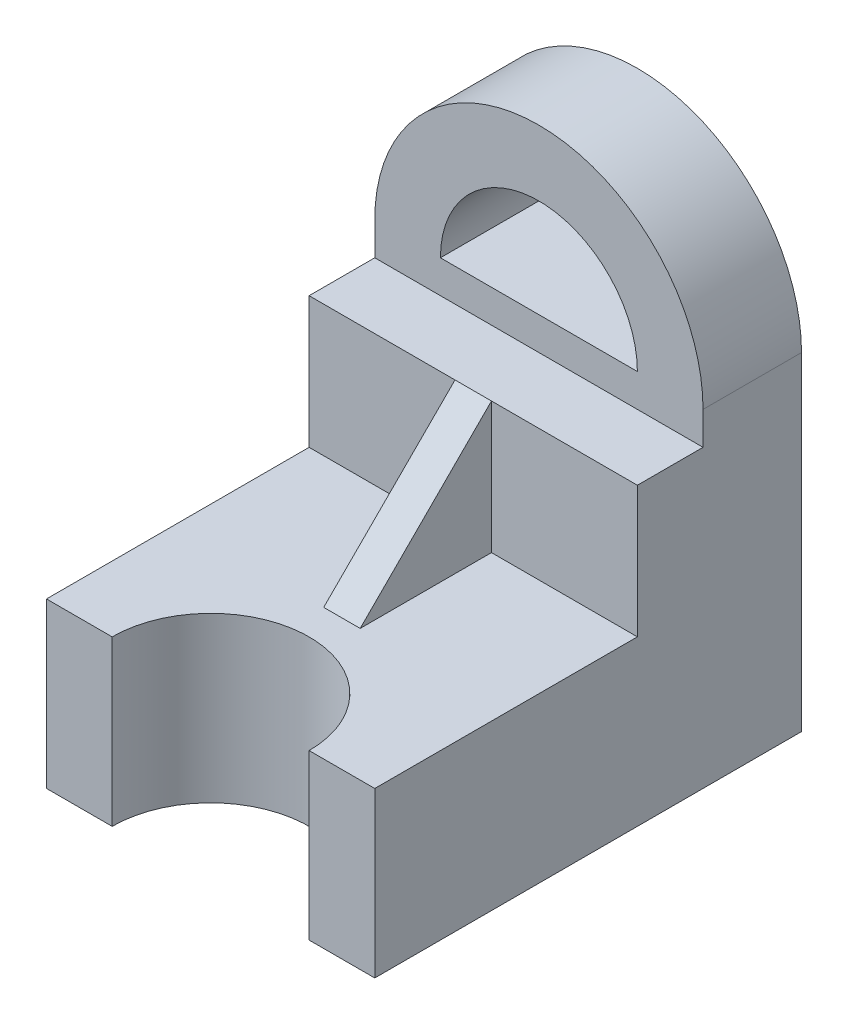
ISO-10303-21;
HEADER;
FILE_DESCRIPTION(('STEP AP214'),'2;1');
FILE_NAME('part.step','',(''),(''),'','','');
FILE_SCHEMA(('AUTOMOTIVE_DESIGN { 1 0 10303 214 1 1 1 1 }'));
ENDSEC;
DATA;
#1=APPLICATION_CONTEXT('core data for automotive mechanical design processes');
#2=APPLICATION_PROTOCOL_DEFINITION('international standard','automotive_design',2000,#1);
#3=PRODUCT_CONTEXT('',#1,'mechanical');
#4=PRODUCT('Part','Part','',(#3));
#5=PRODUCT_RELATED_PRODUCT_CATEGORY('part','',(#4));
#6=PRODUCT_DEFINITION_FORMATION('','',#4);
#7=PRODUCT_DEFINITION_CONTEXT('part definition',#1,'design');
#8=PRODUCT_DEFINITION('design','',#6,#7);
#9=PRODUCT_DEFINITION_SHAPE('','',#8);
#10=(LENGTH_UNIT() NAMED_UNIT(*) SI_UNIT(.MILLI.,.METRE.));
#11=(NAMED_UNIT(*) PLANE_ANGLE_UNIT() SI_UNIT($,.RADIAN.));
#12=(NAMED_UNIT(*) SI_UNIT($,.STERADIAN.) SOLID_ANGLE_UNIT());
#13=UNCERTAINTY_MEASURE_WITH_UNIT(LENGTH_MEASURE(1.E-05),#10,'distance_accuracy_value','');
#14=(GEOMETRIC_REPRESENTATION_CONTEXT(3) GLOBAL_UNCERTAINTY_ASSIGNED_CONTEXT((#13)) GLOBAL_UNIT_ASSIGNED_CONTEXT((#10,
#11,#12)) REPRESENTATION_CONTEXT('',''));
#15=CARTESIAN_POINT('',(0.,0.,0.));
#16=DIRECTION('',(0.,0.,1.));
#17=DIRECTION('',(1.,0.,0.));
#18=AXIS2_PLACEMENT_3D('',#15,#16,#17);
#19=CARTESIAN_POINT('',(0.,0.,-72.));
#20=DIRECTION('',(0.,0.,1.));
#21=DIRECTION('',(1.,0.,0.));
#22=AXIS2_PLACEMENT_3D('',#19,#20,#21);
#23=PLANE('',#22);
#24=DIRECTION('',(1.,0.,0.));
#25=VECTOR('',#24,1.);
#26=CARTESIAN_POINT('',(0.,45.,-72.));
#27=LINE('',#26,#25);
#28=CARTESIAN_POINT('',(0.,45.,-72.));
#29=VERTEX_POINT('',#28);
#30=CARTESIAN_POINT('',(40.,45.,-72.));
#31=VERTEX_POINT('',#30);
#32=EDGE_CURVE('E241',#29,#31,#27,.T.);
#33=ORIENTED_EDGE('',*,*,#32,.T.);
#34=DIRECTION('',(0.,1.,0.));
#35=VECTOR('',#34,1.);
#36=CARTESIAN_POINT('',(40.,0.,-72.));
#37=LINE('',#36,#35);
#38=CARTESIAN_POINT('',(40.,81.,-72.));
#39=VERTEX_POINT('',#38);
#40=EDGE_CURVE('E157',#31,#39,#37,.T.);
#41=ORIENTED_EDGE('',*,*,#40,.T.);
#42=DIRECTION('',(1.,0.,0.));
#43=VECTOR('',#42,1.);
#44=CARTESIAN_POINT('',(0.,81.,-72.));
#45=LINE('',#44,#43);
#46=CARTESIAN_POINT('',(0.,81.,-72.));
#47=VERTEX_POINT('',#46);
#48=EDGE_CURVE('E249',#47,#39,#45,.T.);
#49=ORIENTED_EDGE('',*,*,#48,.F.);
#50=DIRECTION('',(0.,1.,0.));
#51=VECTOR('',#50,1.);
#52=CARTESIAN_POINT('',(0.,0.,-72.));
#53=LINE('',#52,#51);
#54=EDGE_CURVE('E253',#29,#47,#53,.T.);
#55=ORIENTED_EDGE('',*,*,#54,.F.);
#56=EDGE_LOOP('',(#33,#41,#49,#55));
#57=FACE_BOUND('',#56,.T.);
#58=ADVANCED_FACE('F45',(#57),#23,.T.);
#59=CARTESIAN_POINT('',(0.,0.,0.));
#60=DIRECTION('',(0.,0.,1.));
#61=DIRECTION('',(1.,0.,0.));
#62=AXIS2_PLACEMENT_3D('',#59,#60,#61);
#63=PLANE('',#62);
#64=DIRECTION('',(0.,1.,0.));
#65=VECTOR('',#64,1.);
#66=CARTESIAN_POINT('',(72.,0.,0.));
#67=LINE('',#66,#65);
#68=CARTESIAN_POINT('',(72.,0.,0.));
#69=VERTEX_POINT('',#68);
#70=CARTESIAN_POINT('',(72.,45.,0.));
#71=VERTEX_POINT('',#70);
#72=EDGE_CURVE('E189',#69,#71,#67,.T.);
#73=ORIENTED_EDGE('',*,*,#72,.F.);
#74=DIRECTION('',(1.,0.,0.));
#75=VECTOR('',#74,1.);
#76=CARTESIAN_POINT('',(0.,0.,0.));
#77=LINE('',#76,#75);
#78=CARTESIAN_POINT('',(90.,0.,0.));
#79=VERTEX_POINT('',#78);
#80=EDGE_CURVE('E283',#69,#79,#77,.T.);
#81=ORIENTED_EDGE('',*,*,#80,.T.);
#82=DIRECTION('',(0.,1.,0.));
#83=VECTOR('',#82,1.);
#84=CARTESIAN_POINT('',(90.,0.,0.));
#85=LINE('',#84,#83);
#86=CARTESIAN_POINT('',(90.,45.,0.));
#87=VERTEX_POINT('',#86);
#88=EDGE_CURVE('E269',#79,#87,#85,.T.);
#89=ORIENTED_EDGE('',*,*,#88,.T.);
#90=DIRECTION('',(1.,0.,0.));
#91=VECTOR('',#90,1.);
#92=CARTESIAN_POINT('',(0.,45.,0.));
#93=LINE('',#92,#91);
#94=EDGE_CURVE('E261',#71,#87,#93,.T.);
#95=ORIENTED_EDGE('',*,*,#94,.F.);
#96=EDGE_LOOP('',(#73,#81,#89,#95));
#97=FACE_BOUND('',#96,.T.);
#98=ADVANCED_FACE('F312',(#97),#63,.T.);
#99=CARTESIAN_POINT('',(0.,90.,-117.));
#100=DIRECTION('',(0.,-1.,0.));
#101=DIRECTION('',(0.,0.,-1.));
#102=AXIS2_PLACEMENT_3D('',#99,#100,#101);
#103=PLANE('',#102);
#104=DIRECTION('',(0.,0.,1.));
#105=VECTOR('',#104,1.);
#106=CARTESIAN_POINT('',(72.,90.,-117.));
#107=LINE('',#106,#105);
#108=CARTESIAN_POINT('',(72.,90.,-117.));
#109=VERTEX_POINT('',#108);
#110=CARTESIAN_POINT('',(72.,90.,-90.));
#111=VERTEX_POINT('',#110);
#112=EDGE_CURVE('E203',#109,#111,#107,.T.);
#113=ORIENTED_EDGE('',*,*,#112,.F.);
#114=DIRECTION('',(1.,0.,0.));
#115=VECTOR('',#114,1.);
#116=CARTESIAN_POINT('',(0.,90.,-117.));
#117=LINE('',#116,#115);
#118=CARTESIAN_POINT('',(18.,90.,-117.));
#119=VERTEX_POINT('',#118);
#120=EDGE_CURVE('E218',#119,#109,#117,.T.);
#121=ORIENTED_EDGE('',*,*,#120,.F.);
#122=DIRECTION('',(0.,0.,1.));
#123=VECTOR('',#122,1.);
#124=CARTESIAN_POINT('',(18.,90.,-117.));
#125=LINE('',#124,#123);
#126=CARTESIAN_POINT('',(18.,90.,-90.));
#127=VERTEX_POINT('',#126);
#128=EDGE_CURVE('E210',#119,#127,#125,.T.);
#129=ORIENTED_EDGE('',*,*,#128,.T.);
#130=DIRECTION('',(1.,0.,0.));
#131=VECTOR('',#130,1.);
#132=CARTESIAN_POINT('',(0.,90.,-90.));
#133=LINE('',#132,#131);
#134=EDGE_CURVE('E228',#127,#111,#133,.T.);
#135=ORIENTED_EDGE('',*,*,#134,.T.);
#136=EDGE_LOOP('',(#113,#121,#129,#135));
#137=FACE_BOUND('',#136,.T.);
#138=ADVANCED_FACE('F357',(#137),#103,.F.);
#139=CARTESIAN_POINT('',(0.,81.,-117.));
#140=DIRECTION('',(0.,-1.,0.));
#141=DIRECTION('',(0.,0.,-1.));
#142=AXIS2_PLACEMENT_3D('',#139,#140,#141);
#143=PLANE('',#142);
#144=DIRECTION('',(0.,0.,1.));
#145=VECTOR('',#144,1.);
#146=CARTESIAN_POINT('',(90.,81.,-117.));
#147=LINE('',#146,#145);
#148=CARTESIAN_POINT('',(90.,81.,-90.));
#149=VERTEX_POINT('',#148);
#150=CARTESIAN_POINT('',(90.,81.,-72.));
#151=VERTEX_POINT('',#150);
#152=EDGE_CURVE('E257',#149,#151,#147,.T.);
#153=ORIENTED_EDGE('',*,*,#152,.F.);
#154=DIRECTION('',(1.,0.,0.));
#155=VECTOR('',#154,1.);
#156=CARTESIAN_POINT('',(0.,81.,-90.));
#157=LINE('',#156,#155);
#158=CARTESIAN_POINT('',(0.,81.,-90.));
#159=VERTEX_POINT('',#158);
#160=EDGE_CURVE('E214',#159,#149,#157,.T.);
#161=ORIENTED_EDGE('',*,*,#160,.F.);
#162=DIRECTION('',(0.,0.,1.));
#163=VECTOR('',#162,1.);
#164=CARTESIAN_POINT('',(0.,81.,-117.));
#165=LINE('',#164,#163);
#166=EDGE_CURVE('E258',#159,#47,#165,.T.);
#167=ORIENTED_EDGE('',*,*,#166,.T.);
#168=ORIENTED_EDGE('',*,*,#48,.T.);
#169=DIRECTION('',(-1.,0.,0.));
#170=VECTOR('',#169,1.);
#171=CARTESIAN_POINT('',(0.,81.,-72.));
#172=LINE('',#171,#170);
#173=CARTESIAN_POINT('',(50.,81.,-72.));
#174=VERTEX_POINT('',#173);
#175=EDGE_CURVE('E170',#174,#39,#172,.T.);
#176=ORIENTED_EDGE('',*,*,#175,.F.);
#177=EDGE_CURVE('E248',#174,#151,#45,.T.);
#178=ORIENTED_EDGE('',*,*,#177,.T.);
#179=EDGE_LOOP('',(#153,#161,#167,#168,#176,#178));
#180=FACE_BOUND('',#179,.T.);
#181=ADVANCED_FACE('F331',(#180),#143,.F.);
#182=CARTESIAN_POINT('',(0.,45.,-117.));
#183=DIRECTION('',(0.,-1.,0.));
#184=DIRECTION('',(0.,0.,-1.));
#185=AXIS2_PLACEMENT_3D('',#182,#183,#184);
#186=PLANE('',#185);
#187=CARTESIAN_POINT('',(50.,45.,-72.));
#188=VERTEX_POINT('',#187);
#189=CARTESIAN_POINT('',(90.,45.,-72.));
#190=VERTEX_POINT('',#189);
#191=EDGE_CURVE('E237',#188,#190,#27,.T.);
#192=ORIENTED_EDGE('',*,*,#191,.F.);
#193=DIRECTION('',(0.,0.,1.));
#194=VECTOR('',#193,1.);
#195=CARTESIAN_POINT('',(50.,45.,-117.));
#196=LINE('',#195,#194);
#197=CARTESIAN_POINT('',(50.,45.,-36.));
#198=VERTEX_POINT('',#197);
#199=EDGE_CURVE('E176',#188,#198,#196,.T.);
#200=ORIENTED_EDGE('',*,*,#199,.T.);
#201=DIRECTION('',(-1.,0.,0.));
#202=VECTOR('',#201,1.);
#203=CARTESIAN_POINT('',(0.,45.,-36.));
#204=LINE('',#203,#202);
#205=CARTESIAN_POINT('',(40.,45.,-36.));
#206=VERTEX_POINT('',#205);
#207=EDGE_CURVE('E167',#198,#206,#204,.T.);
#208=ORIENTED_EDGE('',*,*,#207,.T.);
#209=DIRECTION('',(0.,0.,1.));
#210=VECTOR('',#209,1.);
#211=CARTESIAN_POINT('',(40.,45.,-117.));
#212=LINE('',#211,#210);
#213=EDGE_CURVE('E154',#31,#206,#212,.T.);
#214=ORIENTED_EDGE('',*,*,#213,.F.);
#215=ORIENTED_EDGE('',*,*,#32,.F.);
#216=DIRECTION('',(0.,0.,1.));
#217=VECTOR('',#216,1.);
#218=CARTESIAN_POINT('',(0.,45.,-117.));
#219=LINE('',#218,#217);
#220=CARTESIAN_POINT('',(0.,45.,0.));
#221=VERTEX_POINT('',#220);
#222=EDGE_CURVE('E49',#29,#221,#219,.T.);
#223=ORIENTED_EDGE('',*,*,#222,.T.);
#224=CARTESIAN_POINT('',(18.,45.,0.));
#225=VERTEX_POINT('',#224);
#226=EDGE_CURVE('E275',#221,#225,#93,.T.);
#227=ORIENTED_EDGE('',*,*,#226,.T.);
#228=CARTESIAN_POINT('',(45.,45.,0.));
#229=DIRECTION('',(0.,1.,0.));
#230=DIRECTION('',(0.,0.,1.));
#231=AXIS2_PLACEMENT_3D('',#228,#229,#230);
#232=CIRCLE('',#231,27.);
#233=EDGE_CURVE('E71',#71,#225,#232,.T.);
#234=ORIENTED_EDGE('',*,*,#233,.F.);
#235=ORIENTED_EDGE('',*,*,#94,.T.);
#236=DIRECTION('',(0.,0.,1.));
#237=VECTOR('',#236,1.);
#238=CARTESIAN_POINT('',(90.,45.,-117.));
#239=LINE('',#238,#237);
#240=EDGE_CURVE('E11',#190,#87,#239,.T.);
#241=ORIENTED_EDGE('',*,*,#240,.F.);
#242=EDGE_LOOP('',(#192,#200,#208,#214,#215,#223,#227,#234,#235,#241));
#243=FACE_BOUND('',#242,.T.);
#244=ADVANCED_FACE('F47',(#243),#186,.F.);
#245=CARTESIAN_POINT('',(90.,0.,-117.));
#246=DIRECTION('',(1.,0.,0.));
#247=DIRECTION('',(0.,0.,-1.));
#248=AXIS2_PLACEMENT_3D('',#245,#246,#247);
#249=PLANE('',#248);
#250=ORIENTED_EDGE('',*,*,#88,.F.);
#251=DIRECTION('',(0.,0.,1.));
#252=VECTOR('',#251,1.);
#253=CARTESIAN_POINT('',(90.,0.,-117.));
#254=LINE('',#253,#252);
#255=CARTESIAN_POINT('',(90.,0.,-117.));
#256=VERTEX_POINT('',#255);
#257=EDGE_CURVE('E55',#256,#79,#254,.T.);
#258=ORIENTED_EDGE('',*,*,#257,.F.);
#259=DIRECTION('',(0.,1.,0.));
#260=VECTOR('',#259,1.);
#261=CARTESIAN_POINT('',(90.,0.,-117.));
#262=LINE('',#261,#260);
#263=CARTESIAN_POINT('',(90.,90.,-117.));
#264=VERTEX_POINT('',#263);
#265=EDGE_CURVE('E272',#256,#264,#262,.T.);
#266=ORIENTED_EDGE('',*,*,#265,.T.);
#267=DIRECTION('',(0.,0.,1.));
#268=VECTOR('',#267,1.);
#269=CARTESIAN_POINT('',(90.,90.,-117.));
#270=LINE('',#269,#268);
#271=CARTESIAN_POINT('',(90.,90.,-90.));
#272=VERTEX_POINT('',#271);
#273=EDGE_CURVE('E221',#264,#272,#270,.T.);
#274=ORIENTED_EDGE('',*,*,#273,.T.);
#275=DIRECTION('',(0.,1.,0.));
#276=VECTOR('',#275,1.);
#277=CARTESIAN_POINT('',(90.,0.,-90.));
#278=LINE('',#277,#276);
#279=EDGE_CURVE('E225',#149,#272,#278,.T.);
#280=ORIENTED_EDGE('',*,*,#279,.F.);
#281=ORIENTED_EDGE('',*,*,#152,.T.);
#282=DIRECTION('',(0.,1.,0.));
#283=VECTOR('',#282,1.);
#284=CARTESIAN_POINT('',(90.,0.,-72.));
#285=LINE('',#284,#283);
#286=EDGE_CURVE('E244',#190,#151,#285,.T.);
#287=ORIENTED_EDGE('',*,*,#286,.F.);
#288=ORIENTED_EDGE('',*,*,#240,.T.);
#289=EDGE_LOOP('',(#250,#258,#266,#274,#280,#281,#287,#288));
#290=FACE_BOUND('',#289,.T.);
#291=ADVANCED_FACE('F327',(#290),#249,.T.);
#292=CARTESIAN_POINT('',(0.,0.,-117.));
#293=DIRECTION('',(0.,-1.,0.));
#294=DIRECTION('',(0.,0.,-1.));
#295=AXIS2_PLACEMENT_3D('',#292,#293,#294);
#296=PLANE('',#295);
#297=CARTESIAN_POINT('',(45.,0.,0.));
#298=DIRECTION('',(0.,1.,0.));
#299=DIRECTION('',(0.,0.,1.));
#300=AXIS2_PLACEMENT_3D('',#297,#298,#299);
#301=CIRCLE('',#300,27.);
#302=CARTESIAN_POINT('',(18.,0.,0.));
#303=VERTEX_POINT('',#302);
#304=EDGE_CURVE('E181',#69,#303,#301,.T.);
#305=ORIENTED_EDGE('',*,*,#304,.T.);
#306=CARTESIAN_POINT('',(0.,0.,0.));
#307=VERTEX_POINT('',#306);
#308=EDGE_CURVE('E284',#307,#303,#77,.T.);
#309=ORIENTED_EDGE('',*,*,#308,.F.);
#310=DIRECTION('',(0.,0.,1.));
#311=VECTOR('',#310,1.);
#312=CARTESIAN_POINT('',(0.,0.,-117.));
#313=LINE('',#312,#311);
#314=CARTESIAN_POINT('',(0.,0.,-117.));
#315=VERTEX_POINT('',#314);
#316=EDGE_CURVE('E293',#315,#307,#313,.T.);
#317=ORIENTED_EDGE('',*,*,#316,.F.);
#318=DIRECTION('',(1.,0.,0.));
#319=VECTOR('',#318,1.);
#320=CARTESIAN_POINT('',(0.,0.,-117.));
#321=LINE('',#320,#319);
#322=EDGE_CURVE('E268',#315,#256,#321,.T.);
#323=ORIENTED_EDGE('',*,*,#322,.T.);
#324=ORIENTED_EDGE('',*,*,#257,.T.);
#325=ORIENTED_EDGE('',*,*,#80,.F.);
#326=EDGE_LOOP('',(#305,#309,#317,#323,#324,#325));
#327=FACE_BOUND('',#326,.T.);
#328=ADVANCED_FACE('F313',(#327),#296,.T.);
#329=CARTESIAN_POINT('',(0.,0.,-117.));
#330=DIRECTION('',(1.,0.,0.));
#331=DIRECTION('',(0.,0.,-1.));
#332=AXIS2_PLACEMENT_3D('',#329,#330,#331);
#333=PLANE('',#332);
#334=DIRECTION('',(0.,1.,0.));
#335=VECTOR('',#334,1.);
#336=CARTESIAN_POINT('',(0.,0.,0.));
#337=LINE('',#336,#335);
#338=EDGE_CURVE('E279',#307,#221,#337,.T.);
#339=ORIENTED_EDGE('',*,*,#338,.T.);
#340=ORIENTED_EDGE('',*,*,#222,.F.);
#341=ORIENTED_EDGE('',*,*,#54,.T.);
#342=ORIENTED_EDGE('',*,*,#166,.F.);
#343=DIRECTION('',(0.,1.,0.));
#344=VECTOR('',#343,1.);
#345=CARTESIAN_POINT('',(0.,0.,-90.));
#346=LINE('',#345,#344);
#347=CARTESIAN_POINT('',(0.,90.,-90.));
#348=VERTEX_POINT('',#347);
#349=EDGE_CURVE('E222',#159,#348,#346,.T.);
#350=ORIENTED_EDGE('',*,*,#349,.T.);
#351=DIRECTION('',(0.,0.,1.));
#352=VECTOR('',#351,1.);
#353=CARTESIAN_POINT('',(0.,90.,-117.));
#354=LINE('',#353,#352);
#355=CARTESIAN_POINT('',(0.,90.,-117.));
#356=VERTEX_POINT('',#355);
#357=EDGE_CURVE('E233',#356,#348,#354,.T.);
#358=ORIENTED_EDGE('',*,*,#357,.F.);
#359=DIRECTION('',(0.,1.,0.));
#360=VECTOR('',#359,1.);
#361=CARTESIAN_POINT('',(0.,0.,-117.));
#362=LINE('',#361,#360);
#363=EDGE_CURVE('E265',#315,#356,#362,.T.);
#364=ORIENTED_EDGE('',*,*,#363,.F.);
#365=ORIENTED_EDGE('',*,*,#316,.T.);
#366=EDGE_LOOP('',(#339,#340,#341,#342,#350,#358,#364,#365));
#367=FACE_BOUND('',#366,.T.);
#368=ADVANCED_FACE('F302',(#367),#333,.F.);
#369=CARTESIAN_POINT('',(0.,0.,-117.));
#370=DIRECTION('',(0.,0.,1.));
#371=DIRECTION('',(1.,0.,0.));
#372=AXIS2_PLACEMENT_3D('',#369,#370,#371);
#373=PLANE('',#372);
#374=ORIENTED_EDGE('',*,*,#120,.T.);
#375=CARTESIAN_POINT('',(45.,90.,-117.));
#376=DIRECTION('',(0.,0.,1.));
#377=DIRECTION('',(1.,0.,0.));
#378=AXIS2_PLACEMENT_3D('',#375,#376,#377);
#379=CIRCLE('',#378,27.);
#380=EDGE_CURVE('E195',#109,#119,#379,.T.);
#381=ORIENTED_EDGE('',*,*,#380,.T.);
#382=EDGE_LOOP('',(#374,#381));
#383=FACE_BOUND('',#382,.T.);
#384=ORIENTED_EDGE('',*,*,#265,.F.);
#385=ORIENTED_EDGE('',*,*,#322,.F.);
#386=ORIENTED_EDGE('',*,*,#363,.T.);
#387=CARTESIAN_POINT('',(45.,90.,-117.));
#388=DIRECTION('',(0.,0.,1.));
#389=DIRECTION('',(1.,0.,0.));
#390=AXIS2_PLACEMENT_3D('',#387,#388,#389);
#391=CIRCLE('',#390,45.);
#392=EDGE_CURVE('E198',#264,#356,#391,.T.);
#393=ORIENTED_EDGE('',*,*,#392,.F.);
#394=EDGE_LOOP('',(#384,#385,#386,#393));
#395=FACE_BOUND('',#394,.T.);
#396=ADVANCED_FACE('F370',(#383,#395),#373,.F.);
#397=DIRECTION('',(0.,1.,0.));
#398=VECTOR('',#397,1.);
#399=CARTESIAN_POINT('',(18.,0.,0.));
#400=LINE('',#399,#398);
#401=EDGE_CURVE('E187',#303,#225,#400,.T.);
#402=ORIENTED_EDGE('',*,*,#401,.T.);
#403=ORIENTED_EDGE('',*,*,#226,.F.);
#404=ORIENTED_EDGE('',*,*,#338,.F.);
#405=ORIENTED_EDGE('',*,*,#308,.T.);
#406=EDGE_LOOP('',(#402,#403,#404,#405));
#407=FACE_BOUND('',#406,.T.);
#408=ADVANCED_FACE('F305',(#407),#63,.T.);
#409=DIRECTION('',(0.,1.,0.));
#410=VECTOR('',#409,1.);
#411=CARTESIAN_POINT('',(50.,0.,-72.));
#412=LINE('',#411,#410);
#413=EDGE_CURVE('E162',#188,#174,#412,.T.);
#414=ORIENTED_EDGE('',*,*,#413,.F.);
#415=ORIENTED_EDGE('',*,*,#191,.T.);
#416=ORIENTED_EDGE('',*,*,#286,.T.);
#417=ORIENTED_EDGE('',*,*,#177,.F.);
#418=EDGE_LOOP('',(#414,#415,#416,#417));
#419=FACE_BOUND('',#418,.T.);
#420=ADVANCED_FACE('F323',(#419),#23,.T.);
#421=CARTESIAN_POINT('',(0.,0.,-90.));
#422=DIRECTION('',(0.,0.,1.));
#423=DIRECTION('',(1.,0.,0.));
#424=AXIS2_PLACEMENT_3D('',#421,#422,#423);
#425=PLANE('',#424);
#426=CARTESIAN_POINT('',(45.,90.,-90.));
#427=DIRECTION('',(0.,0.,1.));
#428=DIRECTION('',(1.,0.,0.));
#429=AXIS2_PLACEMENT_3D('',#426,#427,#428);
#430=CIRCLE('',#429,27.);
#431=EDGE_CURVE('E192',#111,#127,#430,.T.);
#432=ORIENTED_EDGE('',*,*,#431,.F.);
#433=ORIENTED_EDGE('',*,*,#134,.F.);
#434=EDGE_LOOP('',(#432,#433));
#435=FACE_BOUND('',#434,.T.);
#436=ORIENTED_EDGE('',*,*,#160,.T.);
#437=ORIENTED_EDGE('',*,*,#279,.T.);
#438=CARTESIAN_POINT('',(45.,90.,-90.));
#439=DIRECTION('',(0.,0.,1.));
#440=DIRECTION('',(1.,0.,0.));
#441=AXIS2_PLACEMENT_3D('',#438,#439,#440);
#442=CIRCLE('',#441,45.);
#443=EDGE_CURVE('E199',#272,#348,#442,.T.);
#444=ORIENTED_EDGE('',*,*,#443,.T.);
#445=ORIENTED_EDGE('',*,*,#349,.F.);
#446=EDGE_LOOP('',(#436,#437,#444,#445));
#447=FACE_BOUND('',#446,.T.);
#448=ADVANCED_FACE('F362',(#435,#447),#425,.T.);
#449=CARTESIAN_POINT('',(45.,90.,-117.));
#450=DIRECTION('',(0.,0.,1.));
#451=DIRECTION('',(1.,0.,0.));
#452=AXIS2_PLACEMENT_3D('',#449,#450,#451);
#453=CYLINDRICAL_SURFACE('',#452,27.);
#454=ORIENTED_EDGE('',*,*,#128,.F.);
#455=ORIENTED_EDGE('',*,*,#380,.F.);
#456=ORIENTED_EDGE('',*,*,#112,.T.);
#457=ORIENTED_EDGE('',*,*,#431,.T.);
#458=EDGE_LOOP('',(#454,#455,#456,#457));
#459=FACE_BOUND('',#458,.T.);
#460=ADVANCED_FACE('F367',(#459),#453,.F.);
#461=CARTESIAN_POINT('',(45.,90.,-117.));
#462=DIRECTION('',(0.,0.,1.));
#463=DIRECTION('',(1.,0.,0.));
#464=AXIS2_PLACEMENT_3D('',#461,#462,#463);
#465=CYLINDRICAL_SURFACE('',#464,45.);
#466=ORIENTED_EDGE('',*,*,#443,.F.);
#467=ORIENTED_EDGE('',*,*,#273,.F.);
#468=ORIENTED_EDGE('',*,*,#392,.T.);
#469=ORIENTED_EDGE('',*,*,#357,.T.);
#470=EDGE_LOOP('',(#466,#467,#468,#469));
#471=FACE_BOUND('',#470,.T.);
#472=ADVANCED_FACE('F419',(#471),#465,.T.);
#473=CARTESIAN_POINT('',(45.,0.,0.));
#474=DIRECTION('',(0.,1.,0.));
#475=DIRECTION('',(0.,0.,1.));
#476=AXIS2_PLACEMENT_3D('',#473,#474,#475);
#477=CYLINDRICAL_SURFACE('',#476,27.);
#478=ORIENTED_EDGE('',*,*,#401,.F.);
#479=ORIENTED_EDGE('',*,*,#304,.F.);
#480=ORIENTED_EDGE('',*,*,#72,.T.);
#481=ORIENTED_EDGE('',*,*,#233,.T.);
#482=EDGE_LOOP('',(#478,#479,#480,#481));
#483=FACE_BOUND('',#482,.T.);
#484=ADVANCED_FACE('F306',(#483),#477,.F.);
#485=CARTESIAN_POINT('',(45.,81.,-72.));
#486=DIRECTION('',(0.,0.707106781186548,0.707106781186547));
#487=DIRECTION('',(0.,-0.707106781186547,0.707106781186548));
#488=AXIS2_PLACEMENT_3D('',#485,#486,#487);
#489=PLANE('',#488);
#490=ORIENTED_EDGE('',*,*,#207,.F.);
#491=DIRECTION('',(0.,-0.707106781186547,0.707106781186548));
#492=VECTOR('',#491,1.);
#493=CARTESIAN_POINT('',(50.,81.,-72.));
#494=LINE('',#493,#492);
#495=EDGE_CURVE('E172',#174,#198,#494,.T.);
#496=ORIENTED_EDGE('',*,*,#495,.F.);
#497=ORIENTED_EDGE('',*,*,#175,.T.);
#498=DIRECTION('',(0.,-0.707106781186547,0.707106781186548));
#499=VECTOR('',#498,1.);
#500=CARTESIAN_POINT('',(40.,81.,-72.));
#501=LINE('',#500,#499);
#502=EDGE_CURVE('E63',#39,#206,#501,.T.);
#503=ORIENTED_EDGE('',*,*,#502,.T.);
#504=EDGE_LOOP('',(#490,#496,#497,#503));
#505=FACE_BOUND('',#504,.T.);
#506=ADVANCED_FACE('F165',(#505),#489,.T.);
#507=CARTESIAN_POINT('',(50.,67.5,-58.5));
#508=DIRECTION('',(1.,0.,0.));
#509=DIRECTION('',(0.,0.,-1.));
#510=AXIS2_PLACEMENT_3D('',#507,#508,#509);
#511=PLANE('',#510);
#512=ORIENTED_EDGE('',*,*,#199,.F.);
#513=ORIENTED_EDGE('',*,*,#413,.T.);
#514=ORIENTED_EDGE('',*,*,#495,.T.);
#515=EDGE_LOOP('',(#512,#513,#514));
#516=FACE_BOUND('',#515,.T.);
#517=ADVANCED_FACE('F343',(#516),#511,.T.);
#518=CARTESIAN_POINT('',(40.,67.5,-58.5));
#519=DIRECTION('',(1.,0.,0.));
#520=DIRECTION('',(0.,0.,-1.));
#521=AXIS2_PLACEMENT_3D('',#518,#519,#520);
#522=PLANE('',#521);
#523=ORIENTED_EDGE('',*,*,#40,.F.);
#524=ORIENTED_EDGE('',*,*,#213,.T.);
#525=ORIENTED_EDGE('',*,*,#502,.F.);
#526=EDGE_LOOP('',(#523,#524,#525));
#527=FACE_BOUND('',#526,.T.);
#528=ADVANCED_FACE('F155',(#527),#522,.F.);
#529=CLOSED_SHELL('',(#58,#98,#138,#181,#244,#291,#328,#368,#396,#408,#420,#448,#460,#472,#484,
#506,#517,#528));
#530=MANIFOLD_SOLID_BREP('B2',#529);
#531=ADVANCED_BREP_SHAPE_REPRESENTATION('',(#18,#530),#14);
#532=SHAPE_DEFINITION_REPRESENTATION(#9,#531);
ENDSEC;
END-ISO-10303-21;
